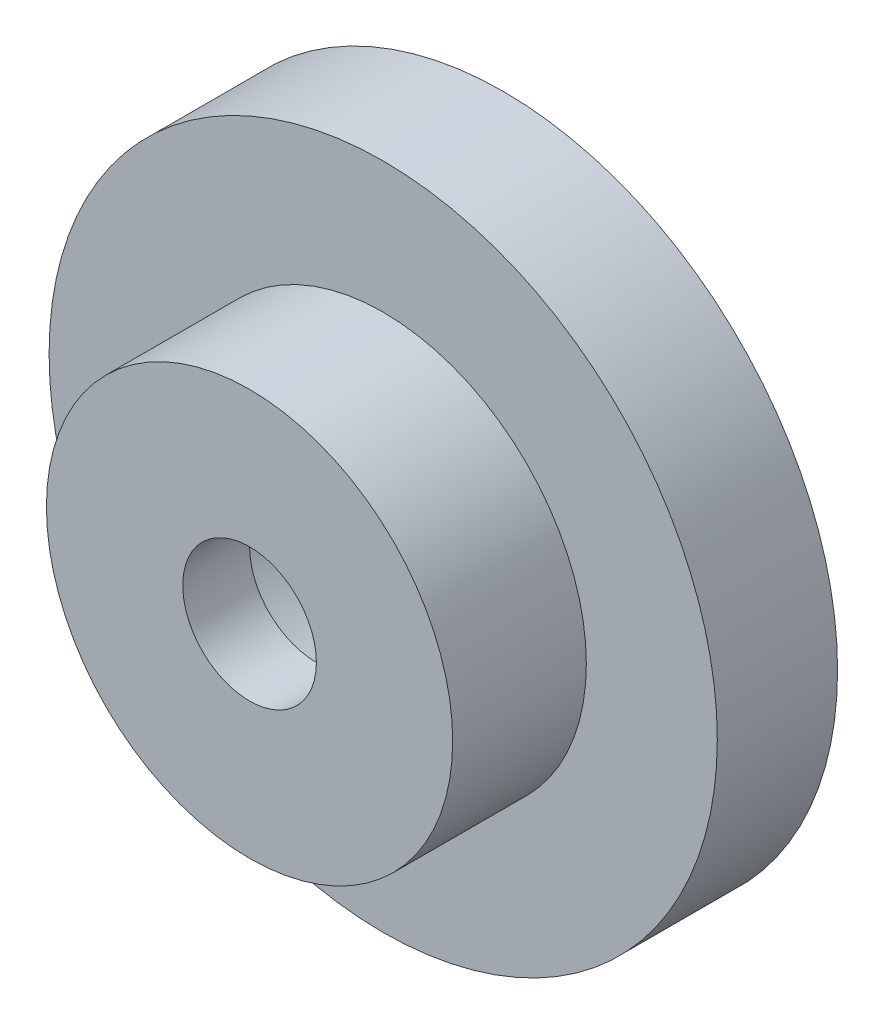
ISO-10303-21;
HEADER;
FILE_DESCRIPTION(('STEP AP214'),'2;1');
FILE_NAME('part.step','',(''),(''),'','','');
FILE_SCHEMA(('AUTOMOTIVE_DESIGN { 1 0 10303 214 1 1 1 1 }'));
ENDSEC;
DATA;
#1=APPLICATION_CONTEXT('core data for automotive mechanical design processes');
#2=APPLICATION_PROTOCOL_DEFINITION('international standard','automotive_design',2000,#1);
#3=PRODUCT_CONTEXT('',#1,'mechanical');
#4=PRODUCT('Part','Part','',(#3));
#5=PRODUCT_RELATED_PRODUCT_CATEGORY('part','',(#4));
#6=PRODUCT_DEFINITION_FORMATION('','',#4);
#7=PRODUCT_DEFINITION_CONTEXT('part definition',#1,'design');
#8=PRODUCT_DEFINITION('design','',#6,#7);
#9=PRODUCT_DEFINITION_SHAPE('','',#8);
#10=(LENGTH_UNIT() NAMED_UNIT(*) SI_UNIT(.MILLI.,.METRE.));
#11=(NAMED_UNIT(*) PLANE_ANGLE_UNIT() SI_UNIT($,.RADIAN.));
#12=(NAMED_UNIT(*) SI_UNIT($,.STERADIAN.) SOLID_ANGLE_UNIT());
#13=UNCERTAINTY_MEASURE_WITH_UNIT(LENGTH_MEASURE(1.E-05),#10,'distance_accuracy_value','');
#14=(GEOMETRIC_REPRESENTATION_CONTEXT(3) GLOBAL_UNCERTAINTY_ASSIGNED_CONTEXT((#13)) GLOBAL_UNIT_ASSIGNED_CONTEXT((#10,
#11,#12)) REPRESENTATION_CONTEXT('',''));
#15=CARTESIAN_POINT('',(0.,0.,0.));
#16=DIRECTION('',(0.,0.,1.));
#17=DIRECTION('',(1.,0.,0.));
#18=AXIS2_PLACEMENT_3D('',#15,#16,#17);
#19=CARTESIAN_POINT('',(0.,0.,3.));
#20=DIRECTION('',(0.,0.,-1.));
#21=DIRECTION('',(-1.,0.,0.));
#22=AXIS2_PLACEMENT_3D('',#19,#20,#21);
#23=CYLINDRICAL_SURFACE('',#22,12.5);
#24=CARTESIAN_POINT('',(0.,0.,3.));
#25=DIRECTION('',(0.,0.,1.));
#26=DIRECTION('',(1.,0.,0.));
#27=AXIS2_PLACEMENT_3D('',#24,#25,#26);
#28=CIRCLE('',#27,12.5);
#29=CARTESIAN_POINT('',(12.5,0.,3.));
#30=VERTEX_POINT('',#29);
#31=EDGE_CURVE('E22',#30,#30,#28,.T.);
#32=ORIENTED_EDGE('',*,*,#31,.F.);
#33=EDGE_LOOP('',(#32));
#34=FACE_BOUND('',#33,.T.);
#35=CARTESIAN_POINT('',(0.,0.,-1.5));
#36=DIRECTION('',(0.,0.,1.));
#37=DIRECTION('',(1.,0.,0.));
#38=AXIS2_PLACEMENT_3D('',#35,#36,#37);
#39=CIRCLE('',#38,12.5);
#40=CARTESIAN_POINT('',(12.5,0.,-1.5));
#41=VERTEX_POINT('',#40);
#42=EDGE_CURVE('E32',#41,#41,#39,.T.);
#43=ORIENTED_EDGE('',*,*,#42,.T.);
#44=EDGE_LOOP('',(#43));
#45=FACE_BOUND('',#44,.T.);
#46=ADVANCED_FACE('F14',(#34,#45),#23,.T.);
#47=CARTESIAN_POINT('',(0.,0.,3.));
#48=DIRECTION('',(0.,0.,1.));
#49=DIRECTION('',(1.,0.,0.));
#50=AXIS2_PLACEMENT_3D('',#47,#48,#49);
#51=PLANE('',#50);
#52=CARTESIAN_POINT('',(0.,0.,3.));
#53=DIRECTION('',(0.,0.,1.));
#54=DIRECTION('',(1.,0.,0.));
#55=AXIS2_PLACEMENT_3D('',#52,#53,#54);
#56=CIRCLE('',#55,7.6);
#57=CARTESIAN_POINT('',(7.6,0.,3.));
#58=VERTEX_POINT('',#57);
#59=EDGE_CURVE('E9',#58,#58,#56,.T.);
#60=ORIENTED_EDGE('',*,*,#59,.F.);
#61=EDGE_LOOP('',(#60));
#62=FACE_BOUND('',#61,.T.);
#63=ORIENTED_EDGE('',*,*,#31,.T.);
#64=EDGE_LOOP('',(#63));
#65=FACE_BOUND('',#64,.T.);
#66=ADVANCED_FACE('F90',(#62,#65),#51,.T.);
#67=CARTESIAN_POINT('',(0.,0.,-1.5));
#68=DIRECTION('',(0.,0.,1.));
#69=DIRECTION('',(1.,0.,0.));
#70=AXIS2_PLACEMENT_3D('',#67,#68,#69);
#71=PLANE('',#70);
#72=CARTESIAN_POINT('',(0.,0.,-1.5));
#73=DIRECTION('',(0.,0.,-1.));
#74=DIRECTION('',(-1.,0.,0.));
#75=AXIS2_PLACEMENT_3D('',#72,#73,#74);
#76=CIRCLE('',#75,6.05);
#77=CARTESIAN_POINT('',(-6.05,0.,-1.5));
#78=VERTEX_POINT('',#77);
#79=EDGE_CURVE('E52',#78,#78,#76,.T.);
#80=ORIENTED_EDGE('',*,*,#79,.F.);
#81=EDGE_LOOP('',(#80));
#82=FACE_BOUND('',#81,.T.);
#83=ORIENTED_EDGE('',*,*,#42,.F.);
#84=EDGE_LOOP('',(#83));
#85=FACE_BOUND('',#84,.T.);
#86=ADVANCED_FACE('F95',(#82,#85),#71,.F.);
#87=CARTESIAN_POINT('',(0.,0.,8.));
#88=DIRECTION('',(0.,0.,-1.));
#89=DIRECTION('',(-1.,0.,0.));
#90=AXIS2_PLACEMENT_3D('',#87,#88,#89);
#91=CYLINDRICAL_SURFACE('',#90,7.6);
#92=CARTESIAN_POINT('',(0.,0.,8.));
#93=DIRECTION('',(0.,0.,1.));
#94=DIRECTION('',(1.,0.,0.));
#95=AXIS2_PLACEMENT_3D('',#92,#93,#94);
#96=CIRCLE('',#95,7.6);
#97=CARTESIAN_POINT('',(7.6,0.,8.));
#98=VERTEX_POINT('',#97);
#99=EDGE_CURVE('E35',#98,#98,#96,.T.);
#100=ORIENTED_EDGE('',*,*,#99,.F.);
#101=EDGE_LOOP('',(#100));
#102=FACE_BOUND('',#101,.T.);
#103=ORIENTED_EDGE('',*,*,#59,.T.);
#104=EDGE_LOOP('',(#103));
#105=FACE_BOUND('',#104,.T.);
#106=ADVANCED_FACE('F103',(#102,#105),#91,.T.);
#107=CARTESIAN_POINT('',(0.,0.,8.));
#108=DIRECTION('',(0.,0.,1.));
#109=DIRECTION('',(1.,0.,0.));
#110=AXIS2_PLACEMENT_3D('',#107,#108,#109);
#111=PLANE('',#110);
#112=CARTESIAN_POINT('',(0.,0.,8.));
#113=DIRECTION('',(0.,0.,1.));
#114=DIRECTION('',(1.,0.,0.));
#115=AXIS2_PLACEMENT_3D('',#112,#113,#114);
#116=CIRCLE('',#115,2.5);
#117=CARTESIAN_POINT('',(2.5,0.,8.));
#118=VERTEX_POINT('',#117);
#119=EDGE_CURVE('E61',#118,#118,#116,.T.);
#120=ORIENTED_EDGE('',*,*,#119,.F.);
#121=EDGE_LOOP('',(#120));
#122=FACE_BOUND('',#121,.T.);
#123=ORIENTED_EDGE('',*,*,#99,.T.);
#124=EDGE_LOOP('',(#123));
#125=FACE_BOUND('',#124,.T.);
#126=ADVANCED_FACE('F86',(#122,#125),#111,.T.);
#127=CARTESIAN_POINT('',(0.,0.,5.5));
#128=DIRECTION('',(0.,0.,-1.));
#129=DIRECTION('',(-1.,0.,0.));
#130=AXIS2_PLACEMENT_3D('',#127,#128,#129);
#131=CYLINDRICAL_SURFACE('',#130,6.05);
#132=CARTESIAN_POINT('',(0.,0.,5.5));
#133=DIRECTION('',(0.,0.,-1.));
#134=DIRECTION('',(-1.,0.,0.));
#135=AXIS2_PLACEMENT_3D('',#132,#133,#134);
#136=CIRCLE('',#135,6.05);
#137=CARTESIAN_POINT('',(-6.05,0.,5.5));
#138=VERTEX_POINT('',#137);
#139=EDGE_CURVE('E44',#138,#138,#136,.T.);
#140=ORIENTED_EDGE('',*,*,#139,.F.);
#141=EDGE_LOOP('',(#140));
#142=FACE_BOUND('',#141,.T.);
#143=ORIENTED_EDGE('',*,*,#79,.T.);
#144=EDGE_LOOP('',(#143));
#145=FACE_BOUND('',#144,.T.);
#146=ADVANCED_FACE('F78',(#142,#145),#131,.F.);
#147=CARTESIAN_POINT('',(0.,0.,5.5));
#148=DIRECTION('',(0.,0.,-1.));
#149=DIRECTION('',(1.,0.,0.));
#150=AXIS2_PLACEMENT_3D('',#147,#148,#149);
#151=PLANE('',#150);
#152=CARTESIAN_POINT('',(0.,0.,5.5));
#153=DIRECTION('',(0.,0.,-1.));
#154=DIRECTION('',(-1.,0.,0.));
#155=AXIS2_PLACEMENT_3D('',#152,#153,#154);
#156=CIRCLE('',#155,2.5);
#157=CARTESIAN_POINT('',(-2.5,0.,5.5));
#158=VERTEX_POINT('',#157);
#159=EDGE_CURVE('E17',#158,#158,#156,.T.);
#160=ORIENTED_EDGE('',*,*,#159,.F.);
#161=EDGE_LOOP('',(#160));
#162=FACE_BOUND('',#161,.T.);
#163=ORIENTED_EDGE('',*,*,#139,.T.);
#164=EDGE_LOOP('',(#163));
#165=FACE_BOUND('',#164,.T.);
#166=ADVANCED_FACE('F76',(#162,#165),#151,.T.);
#167=CARTESIAN_POINT('',(0.,0.,5.1));
#168=DIRECTION('',(0.,0.,1.));
#169=DIRECTION('',(1.,0.,0.));
#170=AXIS2_PLACEMENT_3D('',#167,#168,#169);
#171=CYLINDRICAL_SURFACE('',#170,2.5);
#172=ORIENTED_EDGE('',*,*,#159,.T.);
#173=EDGE_LOOP('',(#172));
#174=FACE_BOUND('',#173,.T.);
#175=ORIENTED_EDGE('',*,*,#119,.T.);
#176=EDGE_LOOP('',(#175));
#177=FACE_BOUND('',#176,.T.);
#178=ADVANCED_FACE('F74',(#174,#177),#171,.F.);
#179=CLOSED_SHELL('',(#46,#66,#86,#106,#126,#146,#166,#178));
#180=MANIFOLD_SOLID_BREP('B1',#179);
#181=ADVANCED_BREP_SHAPE_REPRESENTATION('',(#18,#180),#14);
#182=SHAPE_DEFINITION_REPRESENTATION(#9,#181);
ENDSEC;
END-ISO-10303-21;
